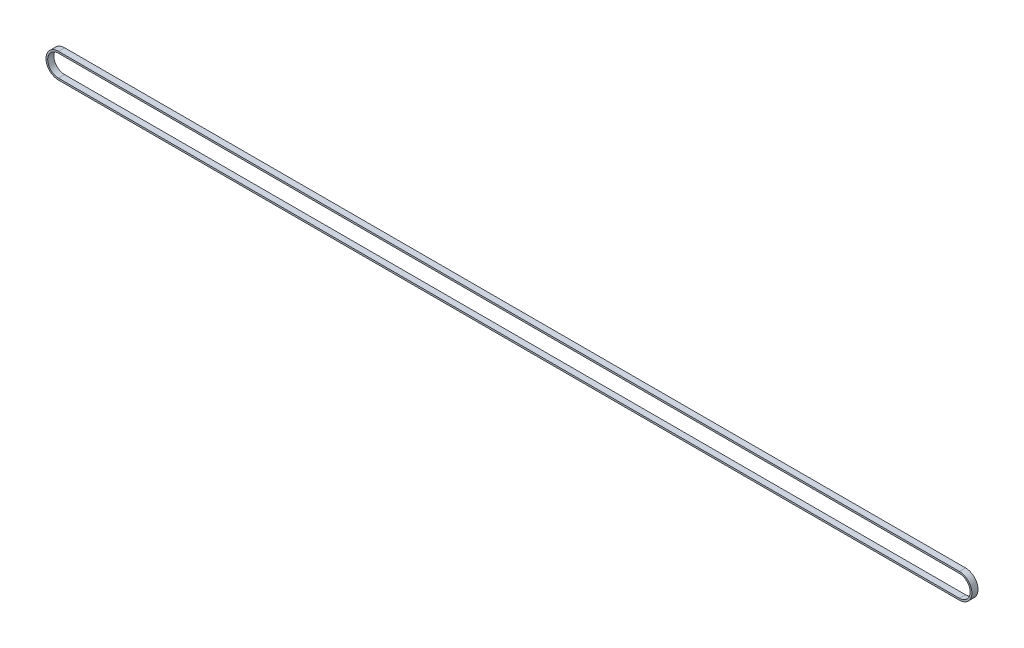
ISO-10303-21;
HEADER;
FILE_DESCRIPTION(('STEP AP214'),'2;1');
FILE_NAME('part.step','',(''),(''),'','','');
FILE_SCHEMA(('AUTOMOTIVE_DESIGN { 1 0 10303 214 1 1 1 1 }'));
ENDSEC;
DATA;
#1=APPLICATION_CONTEXT('core data for automotive mechanical design processes');
#2=APPLICATION_PROTOCOL_DEFINITION('international standard','automotive_design',2000,#1);
#3=PRODUCT_CONTEXT('',#1,'mechanical');
#4=PRODUCT('Part','Part','',(#3));
#5=PRODUCT_RELATED_PRODUCT_CATEGORY('part','',(#4));
#6=PRODUCT_DEFINITION_FORMATION('','',#4);
#7=PRODUCT_DEFINITION_CONTEXT('part definition',#1,'design');
#8=PRODUCT_DEFINITION('design','',#6,#7);
#9=PRODUCT_DEFINITION_SHAPE('','',#8);
#10=(LENGTH_UNIT() NAMED_UNIT(*) SI_UNIT(.MILLI.,.METRE.));
#11=(NAMED_UNIT(*) PLANE_ANGLE_UNIT() SI_UNIT($,.RADIAN.));
#12=(NAMED_UNIT(*) SI_UNIT($,.STERADIAN.) SOLID_ANGLE_UNIT());
#13=UNCERTAINTY_MEASURE_WITH_UNIT(LENGTH_MEASURE(1.E-05),#10,'distance_accuracy_value','');
#14=(GEOMETRIC_REPRESENTATION_CONTEXT(3) GLOBAL_UNCERTAINTY_ASSIGNED_CONTEXT((#13)) GLOBAL_UNIT_ASSIGNED_CONTEXT((#10,
#11,#12)) REPRESENTATION_CONTEXT('',''));
#15=CARTESIAN_POINT('',(0.,0.,0.));
#16=DIRECTION('',(0.,0.,1.));
#17=DIRECTION('',(1.,0.,0.));
#18=AXIS2_PLACEMENT_3D('',#15,#16,#17);
#19=CARTESIAN_POINT('',(0.,0.,2.5));
#20=DIRECTION('',(0.,0.,1.));
#21=DIRECTION('',(1.,0.,0.));
#22=AXIS2_PLACEMENT_3D('',#19,#20,#21);
#23=PLANE('',#22);
#24=CARTESIAN_POINT('',(0.,0.,2.5));
#25=DIRECTION('',(0.,0.,1.));
#26=DIRECTION('',(1.,0.,0.));
#27=AXIS2_PLACEMENT_3D('',#24,#25,#26);
#28=CIRCLE('',#27,10.13);
#29=CARTESIAN_POINT('',(0.,10.13,2.5));
#30=VERTEX_POINT('',#29);
#31=CARTESIAN_POINT('',(0.,-10.13,2.5));
#32=VERTEX_POINT('',#31);
#33=EDGE_CURVE('E159',#30,#32,#28,.T.);
#34=ORIENTED_EDGE('',*,*,#33,.T.);
#35=DIRECTION('',(1.,0.,0.));
#36=VECTOR('',#35,1.);
#37=CARTESIAN_POINT('',(732.,-10.13,2.5));
#38=LINE('',#37,#36);
#39=CARTESIAN_POINT('',(732.,-10.13,2.5));
#40=VERTEX_POINT('',#39);
#41=EDGE_CURVE('E162',#32,#40,#38,.T.);
#42=ORIENTED_EDGE('',*,*,#41,.T.);
#43=CARTESIAN_POINT('',(732.,0.,2.5));
#44=DIRECTION('',(0.,0.,1.));
#45=DIRECTION('',(1.,0.,0.));
#46=AXIS2_PLACEMENT_3D('',#43,#44,#45);
#47=CIRCLE('',#46,10.13);
#48=CARTESIAN_POINT('',(732.,10.13,2.5));
#49=VERTEX_POINT('',#48);
#50=EDGE_CURVE('E165',#40,#49,#47,.T.);
#51=ORIENTED_EDGE('',*,*,#50,.T.);
#52=DIRECTION('',(-1.,0.,0.));
#53=VECTOR('',#52,1.);
#54=CARTESIAN_POINT('',(0.,10.13,2.5));
#55=LINE('',#54,#53);
#56=EDGE_CURVE('E167',#49,#30,#55,.T.);
#57=ORIENTED_EDGE('',*,*,#56,.T.);
#58=EDGE_LOOP('',(#34,#42,#51,#57));
#59=FACE_BOUND('',#58,.T.);
#60=DIRECTION('',(1.,0.,0.));
#61=VECTOR('',#60,1.);
#62=CARTESIAN_POINT('',(732.,-8.75,2.5));
#63=LINE('',#62,#61);
#64=CARTESIAN_POINT('',(0.,-8.75,2.5));
#65=VERTEX_POINT('',#64);
#66=CARTESIAN_POINT('',(732.,-8.75,2.5));
#67=VERTEX_POINT('',#66);
#68=EDGE_CURVE('E131',#65,#67,#63,.T.);
#69=ORIENTED_EDGE('',*,*,#68,.F.);
#70=CARTESIAN_POINT('',(0.,0.,2.5));
#71=DIRECTION('',(0.,0.,1.));
#72=DIRECTION('',(1.,0.,0.));
#73=AXIS2_PLACEMENT_3D('',#70,#71,#72);
#74=CIRCLE('',#73,8.75);
#75=CARTESIAN_POINT('',(0.,8.75,2.5));
#76=VERTEX_POINT('',#75);
#77=EDGE_CURVE('E123',#76,#65,#74,.T.);
#78=ORIENTED_EDGE('',*,*,#77,.F.);
#79=DIRECTION('',(-1.,0.,0.));
#80=VECTOR('',#79,1.);
#81=CARTESIAN_POINT('',(0.,8.75,2.5));
#82=LINE('',#81,#80);
#83=CARTESIAN_POINT('',(732.,8.75,2.5));
#84=VERTEX_POINT('',#83);
#85=EDGE_CURVE('E145',#84,#76,#82,.T.);
#86=ORIENTED_EDGE('',*,*,#85,.F.);
#87=CARTESIAN_POINT('',(732.,0.,2.5));
#88=DIRECTION('',(0.,0.,1.));
#89=DIRECTION('',(1.,0.,0.));
#90=AXIS2_PLACEMENT_3D('',#87,#88,#89);
#91=CIRCLE('',#90,8.75);
#92=EDGE_CURVE('E143',#67,#84,#91,.T.);
#93=ORIENTED_EDGE('',*,*,#92,.F.);
#94=EDGE_LOOP('',(#69,#78,#86,#93));
#95=FACE_BOUND('',#94,.T.);
#96=ADVANCED_FACE('F58',(#59,#95),#23,.T.);
#97=CARTESIAN_POINT('',(0.,0.,-2.5));
#98=DIRECTION('',(0.,0.,1.));
#99=DIRECTION('',(1.,0.,0.));
#100=AXIS2_PLACEMENT_3D('',#97,#98,#99);
#101=PLANE('',#100);
#102=CARTESIAN_POINT('',(0.,0.,-2.5));
#103=DIRECTION('',(0.,0.,1.));
#104=DIRECTION('',(1.,0.,0.));
#105=AXIS2_PLACEMENT_3D('',#102,#103,#104);
#106=CIRCLE('',#105,10.13);
#107=CARTESIAN_POINT('',(0.,10.13,-2.5));
#108=VERTEX_POINT('',#107);
#109=CARTESIAN_POINT('',(0.,-10.13,-2.5));
#110=VERTEX_POINT('',#109);
#111=EDGE_CURVE('E139',#108,#110,#106,.T.);
#112=ORIENTED_EDGE('',*,*,#111,.F.);
#113=DIRECTION('',(-1.,0.,0.));
#114=VECTOR('',#113,1.);
#115=CARTESIAN_POINT('',(0.,10.13,-2.5));
#116=LINE('',#115,#114);
#117=CARTESIAN_POINT('',(732.,10.13,-2.5));
#118=VERTEX_POINT('',#117);
#119=EDGE_CURVE('E163',#118,#108,#116,.T.);
#120=ORIENTED_EDGE('',*,*,#119,.F.);
#121=CARTESIAN_POINT('',(732.,0.,-2.5));
#122=DIRECTION('',(0.,0.,1.));
#123=DIRECTION('',(1.,0.,0.));
#124=AXIS2_PLACEMENT_3D('',#121,#122,#123);
#125=CIRCLE('',#124,10.13);
#126=CARTESIAN_POINT('',(732.,-10.13,-2.5));
#127=VERTEX_POINT('',#126);
#128=EDGE_CURVE('E174',#127,#118,#125,.T.);
#129=ORIENTED_EDGE('',*,*,#128,.F.);
#130=DIRECTION('',(1.,0.,0.));
#131=VECTOR('',#130,1.);
#132=CARTESIAN_POINT('',(732.,-10.13,-2.5));
#133=LINE('',#132,#131);
#134=EDGE_CURVE('E172',#110,#127,#133,.T.);
#135=ORIENTED_EDGE('',*,*,#134,.F.);
#136=EDGE_LOOP('',(#112,#120,#129,#135));
#137=FACE_BOUND('',#136,.T.);
#138=CARTESIAN_POINT('',(0.,0.,-2.5));
#139=DIRECTION('',(0.,0.,1.));
#140=DIRECTION('',(1.,0.,0.));
#141=AXIS2_PLACEMENT_3D('',#138,#139,#140);
#142=CIRCLE('',#141,8.75);
#143=CARTESIAN_POINT('',(0.,8.75,-2.5));
#144=VERTEX_POINT('',#143);
#145=CARTESIAN_POINT('',(0.,-8.75,-2.5));
#146=VERTEX_POINT('',#145);
#147=EDGE_CURVE('E81',#144,#146,#142,.T.);
#148=ORIENTED_EDGE('',*,*,#147,.T.);
#149=DIRECTION('',(1.,0.,0.));
#150=VECTOR('',#149,1.);
#151=CARTESIAN_POINT('',(732.,-8.75,-2.5));
#152=LINE('',#151,#150);
#153=CARTESIAN_POINT('',(732.,-8.75,-2.5));
#154=VERTEX_POINT('',#153);
#155=EDGE_CURVE('E138',#146,#154,#152,.T.);
#156=ORIENTED_EDGE('',*,*,#155,.T.);
#157=CARTESIAN_POINT('',(732.,0.,-2.5));
#158=DIRECTION('',(0.,0.,1.));
#159=DIRECTION('',(1.,0.,0.));
#160=AXIS2_PLACEMENT_3D('',#157,#158,#159);
#161=CIRCLE('',#160,8.75);
#162=CARTESIAN_POINT('',(732.,8.75,-2.5));
#163=VERTEX_POINT('',#162);
#164=EDGE_CURVE('E151',#154,#163,#161,.T.);
#165=ORIENTED_EDGE('',*,*,#164,.T.);
#166=DIRECTION('',(-1.,0.,0.));
#167=VECTOR('',#166,1.);
#168=CARTESIAN_POINT('',(0.,8.75,-2.5));
#169=LINE('',#168,#167);
#170=EDGE_CURVE('E132',#163,#144,#169,.T.);
#171=ORIENTED_EDGE('',*,*,#170,.T.);
#172=EDGE_LOOP('',(#148,#156,#165,#171));
#173=FACE_BOUND('',#172,.T.);
#174=ADVANCED_FACE('F192',(#137,#173),#101,.F.);
#175=CARTESIAN_POINT('',(0.,0.,2.5));
#176=DIRECTION('',(0.,0.,-1.));
#177=DIRECTION('',(-1.,0.,0.));
#178=AXIS2_PLACEMENT_3D('',#175,#176,#177);
#179=CYLINDRICAL_SURFACE('',#178,10.13);
#180=ORIENTED_EDGE('',*,*,#111,.T.);
#181=DIRECTION('',(0.,0.,-1.));
#182=VECTOR('',#181,1.);
#183=CARTESIAN_POINT('',(0.,-10.13,2.5));
#184=LINE('',#183,#182);
#185=EDGE_CURVE('E12',#32,#110,#184,.T.);
#186=ORIENTED_EDGE('',*,*,#185,.F.);
#187=ORIENTED_EDGE('',*,*,#33,.F.);
#188=DIRECTION('',(0.,0.,-1.));
#189=VECTOR('',#188,1.);
#190=CARTESIAN_POINT('',(0.,10.13,2.5));
#191=LINE('',#190,#189);
#192=EDGE_CURVE('E169',#30,#108,#191,.T.);
#193=ORIENTED_EDGE('',*,*,#192,.T.);
#194=EDGE_LOOP('',(#180,#186,#187,#193));
#195=FACE_BOUND('',#194,.T.);
#196=ADVANCED_FACE('F60',(#195),#179,.T.);
#197=CARTESIAN_POINT('',(732.,-10.13,2.5));
#198=DIRECTION('',(0.,1.,0.));
#199=DIRECTION('',(0.,0.,1.));
#200=AXIS2_PLACEMENT_3D('',#197,#198,#199);
#201=PLANE('',#200);
#202=ORIENTED_EDGE('',*,*,#134,.T.);
#203=DIRECTION('',(0.,0.,-1.));
#204=VECTOR('',#203,1.);
#205=CARTESIAN_POINT('',(732.,-10.13,2.5));
#206=LINE('',#205,#204);
#207=EDGE_CURVE('E66',#40,#127,#206,.T.);
#208=ORIENTED_EDGE('',*,*,#207,.F.);
#209=ORIENTED_EDGE('',*,*,#41,.F.);
#210=ORIENTED_EDGE('',*,*,#185,.T.);
#211=EDGE_LOOP('',(#202,#208,#209,#210));
#212=FACE_BOUND('',#211,.T.);
#213=ADVANCED_FACE('F202',(#212),#201,.F.);
#214=CARTESIAN_POINT('',(732.,0.,2.5));
#215=DIRECTION('',(0.,0.,-1.));
#216=DIRECTION('',(-1.,0.,0.));
#217=AXIS2_PLACEMENT_3D('',#214,#215,#216);
#218=CYLINDRICAL_SURFACE('',#217,10.13);
#219=ORIENTED_EDGE('',*,*,#128,.T.);
#220=DIRECTION('',(0.,0.,-1.));
#221=VECTOR('',#220,1.);
#222=CARTESIAN_POINT('',(732.,10.13,2.5));
#223=LINE('',#222,#221);
#224=EDGE_CURVE('E179',#49,#118,#223,.T.);
#225=ORIENTED_EDGE('',*,*,#224,.F.);
#226=ORIENTED_EDGE('',*,*,#50,.F.);
#227=ORIENTED_EDGE('',*,*,#207,.T.);
#228=EDGE_LOOP('',(#219,#225,#226,#227));
#229=FACE_BOUND('',#228,.T.);
#230=ADVANCED_FACE('F186',(#229),#218,.T.);
#231=CARTESIAN_POINT('',(0.,10.13,2.5));
#232=DIRECTION('',(0.,-1.,0.));
#233=DIRECTION('',(0.,0.,-1.));
#234=AXIS2_PLACEMENT_3D('',#231,#232,#233);
#235=PLANE('',#234);
#236=ORIENTED_EDGE('',*,*,#119,.T.);
#237=ORIENTED_EDGE('',*,*,#192,.F.);
#238=ORIENTED_EDGE('',*,*,#56,.F.);
#239=ORIENTED_EDGE('',*,*,#224,.T.);
#240=EDGE_LOOP('',(#236,#237,#238,#239));
#241=FACE_BOUND('',#240,.T.);
#242=ADVANCED_FACE('F196',(#241),#235,.F.);
#243=CARTESIAN_POINT('',(0.,0.,2.5));
#244=DIRECTION('',(0.,0.,-1.));
#245=DIRECTION('',(-1.,0.,0.));
#246=AXIS2_PLACEMENT_3D('',#243,#244,#245);
#247=CYLINDRICAL_SURFACE('',#246,8.75);
#248=ORIENTED_EDGE('',*,*,#147,.F.);
#249=DIRECTION('',(0.,0.,-1.));
#250=VECTOR('',#249,1.);
#251=CARTESIAN_POINT('',(0.,8.75,2.5));
#252=LINE('',#251,#250);
#253=EDGE_CURVE('E127',#76,#144,#252,.T.);
#254=ORIENTED_EDGE('',*,*,#253,.F.);
#255=ORIENTED_EDGE('',*,*,#77,.T.);
#256=DIRECTION('',(0.,0.,-1.));
#257=VECTOR('',#256,1.);
#258=CARTESIAN_POINT('',(0.,-8.75,2.5));
#259=LINE('',#258,#257);
#260=EDGE_CURVE('E126',#65,#146,#259,.T.);
#261=ORIENTED_EDGE('',*,*,#260,.T.);
#262=EDGE_LOOP('',(#248,#254,#255,#261));
#263=FACE_BOUND('',#262,.T.);
#264=ADVANCED_FACE('F125',(#263),#247,.F.);
#265=CARTESIAN_POINT('',(732.,-8.75,2.5));
#266=DIRECTION('',(0.,1.,0.));
#267=DIRECTION('',(0.,0.,1.));
#268=AXIS2_PLACEMENT_3D('',#265,#266,#267);
#269=PLANE('',#268);
#270=ORIENTED_EDGE('',*,*,#155,.F.);
#271=ORIENTED_EDGE('',*,*,#260,.F.);
#272=ORIENTED_EDGE('',*,*,#68,.T.);
#273=DIRECTION('',(0.,0.,-1.));
#274=VECTOR('',#273,1.);
#275=CARTESIAN_POINT('',(732.,-8.75,2.5));
#276=LINE('',#275,#274);
#277=EDGE_CURVE('E140',#67,#154,#276,.T.);
#278=ORIENTED_EDGE('',*,*,#277,.T.);
#279=EDGE_LOOP('',(#270,#271,#272,#278));
#280=FACE_BOUND('',#279,.T.);
#281=ADVANCED_FACE('F135',(#280),#269,.T.);
#282=CARTESIAN_POINT('',(732.,0.,2.5));
#283=DIRECTION('',(0.,0.,-1.));
#284=DIRECTION('',(-1.,0.,0.));
#285=AXIS2_PLACEMENT_3D('',#282,#283,#284);
#286=CYLINDRICAL_SURFACE('',#285,8.75);
#287=ORIENTED_EDGE('',*,*,#164,.F.);
#288=ORIENTED_EDGE('',*,*,#277,.F.);
#289=ORIENTED_EDGE('',*,*,#92,.T.);
#290=DIRECTION('',(0.,0.,-1.));
#291=VECTOR('',#290,1.);
#292=CARTESIAN_POINT('',(732.,8.75,2.5));
#293=LINE('',#292,#291);
#294=EDGE_CURVE('E73',#84,#163,#293,.T.);
#295=ORIENTED_EDGE('',*,*,#294,.T.);
#296=EDGE_LOOP('',(#287,#288,#289,#295));
#297=FACE_BOUND('',#296,.T.);
#298=ADVANCED_FACE('F225',(#297),#286,.F.);
#299=CARTESIAN_POINT('',(0.,8.75,2.5));
#300=DIRECTION('',(0.,-1.,0.));
#301=DIRECTION('',(0.,0.,-1.));
#302=AXIS2_PLACEMENT_3D('',#299,#300,#301);
#303=PLANE('',#302);
#304=ORIENTED_EDGE('',*,*,#170,.F.);
#305=ORIENTED_EDGE('',*,*,#294,.F.);
#306=ORIENTED_EDGE('',*,*,#85,.T.);
#307=ORIENTED_EDGE('',*,*,#253,.T.);
#308=EDGE_LOOP('',(#304,#305,#306,#307));
#309=FACE_BOUND('',#308,.T.);
#310=ADVANCED_FACE('F229',(#309),#303,.T.);
#311=CLOSED_SHELL('',(#96,#174,#196,#213,#230,#242,#264,#281,#298,#310));
#312=MANIFOLD_SOLID_BREP('B2',#311);
#313=ADVANCED_BREP_SHAPE_REPRESENTATION('',(#18,#312),#14);
#314=SHAPE_DEFINITION_REPRESENTATION(#9,#313);
ENDSEC;
END-ISO-10303-21;
